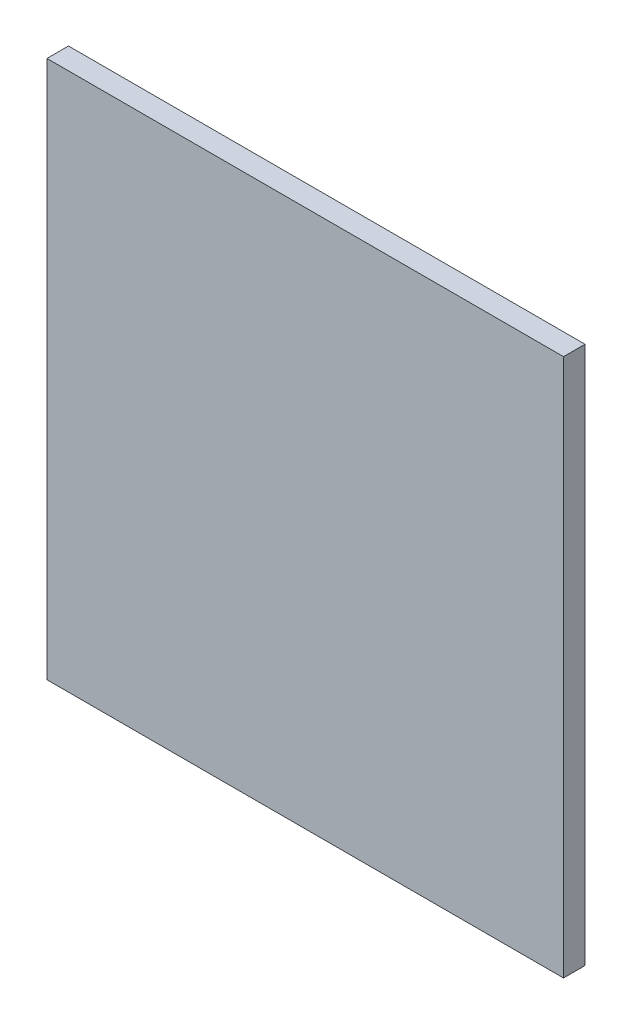
ISO-10303-21;
HEADER;
FILE_DESCRIPTION(('STEP AP214'),'2;1');
FILE_NAME('part.step','',(''),(''),'','','');
FILE_SCHEMA(('AUTOMOTIVE_DESIGN { 1 0 10303 214 1 1 1 1 }'));
ENDSEC;
DATA;
#1=APPLICATION_CONTEXT('core data for automotive mechanical design processes');
#2=APPLICATION_PROTOCOL_DEFINITION('international standard','automotive_design',2000,#1);
#3=PRODUCT_CONTEXT('',#1,'mechanical');
#4=PRODUCT('Part','Part','',(#3));
#5=PRODUCT_RELATED_PRODUCT_CATEGORY('part','',(#4));
#6=PRODUCT_DEFINITION_FORMATION('','',#4);
#7=PRODUCT_DEFINITION_CONTEXT('part definition',#1,'design');
#8=PRODUCT_DEFINITION('design','',#6,#7);
#9=PRODUCT_DEFINITION_SHAPE('','',#8);
#10=(LENGTH_UNIT() NAMED_UNIT(*) SI_UNIT(.MILLI.,.METRE.));
#11=(NAMED_UNIT(*) PLANE_ANGLE_UNIT() SI_UNIT($,.RADIAN.));
#12=(NAMED_UNIT(*) SI_UNIT($,.STERADIAN.) SOLID_ANGLE_UNIT());
#13=UNCERTAINTY_MEASURE_WITH_UNIT(LENGTH_MEASURE(1.E-05),#10,'distance_accuracy_value','');
#14=(GEOMETRIC_REPRESENTATION_CONTEXT(3) GLOBAL_UNCERTAINTY_ASSIGNED_CONTEXT((#13)) GLOBAL_UNIT_ASSIGNED_CONTEXT((#10,
#11,#12)) REPRESENTATION_CONTEXT('',''));
#15=CARTESIAN_POINT('',(0.,0.,0.));
#16=DIRECTION('',(0.,0.,1.));
#17=DIRECTION('',(1.,0.,0.));
#18=AXIS2_PLACEMENT_3D('',#15,#16,#17);
#19=CARTESIAN_POINT('',(240.,250.,20.));
#20=DIRECTION('',(-1.,0.,0.));
#21=DIRECTION('',(0.,-1.,0.));
#22=AXIS2_PLACEMENT_3D('',#19,#20,#21);
#23=PLANE('',#22);
#24=DIRECTION('',(0.,1.,0.));
#25=VECTOR('',#24,1.);
#26=CARTESIAN_POINT('',(240.,250.,0.));
#27=LINE('',#26,#25);
#28=CARTESIAN_POINT('',(240.,-250.,0.));
#29=VERTEX_POINT('',#28);
#30=CARTESIAN_POINT('',(240.,250.,0.));
#31=VERTEX_POINT('',#30);
#32=EDGE_CURVE('E100',#29,#31,#27,.T.);
#33=ORIENTED_EDGE('',*,*,#32,.T.);
#34=DIRECTION('',(0.,0.,-1.));
#35=VECTOR('',#34,1.);
#36=CARTESIAN_POINT('',(240.,250.,20.));
#37=LINE('',#36,#35);
#38=CARTESIAN_POINT('',(240.,250.,20.));
#39=VERTEX_POINT('',#38);
#40=EDGE_CURVE('E11',#39,#31,#37,.T.);
#41=ORIENTED_EDGE('',*,*,#40,.F.);
#42=DIRECTION('',(0.,1.,0.));
#43=VECTOR('',#42,1.);
#44=CARTESIAN_POINT('',(240.,250.,20.));
#45=LINE('',#44,#43);
#46=CARTESIAN_POINT('',(240.,-250.,20.));
#47=VERTEX_POINT('',#46);
#48=EDGE_CURVE('E88',#47,#39,#45,.T.);
#49=ORIENTED_EDGE('',*,*,#48,.F.);
#50=DIRECTION('',(0.,0.,-1.));
#51=VECTOR('',#50,1.);
#52=CARTESIAN_POINT('',(240.,-250.,20.));
#53=LINE('',#52,#51);
#54=EDGE_CURVE('E96',#47,#29,#53,.T.);
#55=ORIENTED_EDGE('',*,*,#54,.T.);
#56=EDGE_LOOP('',(#33,#41,#49,#55));
#57=FACE_BOUND('',#56,.T.);
#58=ADVANCED_FACE('F37',(#57),#23,.F.);
#59=CARTESIAN_POINT('',(-240.,250.,20.));
#60=DIRECTION('',(0.,-1.,0.));
#61=DIRECTION('',(0.,0.,-1.));
#62=AXIS2_PLACEMENT_3D('',#59,#60,#61);
#63=PLANE('',#62);
#64=DIRECTION('',(-1.,0.,0.));
#65=VECTOR('',#64,1.);
#66=CARTESIAN_POINT('',(-240.,250.,0.));
#67=LINE('',#66,#65);
#68=CARTESIAN_POINT('',(-240.,250.,0.));
#69=VERTEX_POINT('',#68);
#70=EDGE_CURVE('E92',#31,#69,#67,.T.);
#71=ORIENTED_EDGE('',*,*,#70,.T.);
#72=DIRECTION('',(0.,0.,-1.));
#73=VECTOR('',#72,1.);
#74=CARTESIAN_POINT('',(-240.,250.,20.));
#75=LINE('',#74,#73);
#76=CARTESIAN_POINT('',(-240.,250.,20.));
#77=VERTEX_POINT('',#76);
#78=EDGE_CURVE('E45',#77,#69,#75,.T.);
#79=ORIENTED_EDGE('',*,*,#78,.F.);
#80=DIRECTION('',(-1.,0.,0.));
#81=VECTOR('',#80,1.);
#82=CARTESIAN_POINT('',(-240.,250.,20.));
#83=LINE('',#82,#81);
#84=EDGE_CURVE('E83',#39,#77,#83,.T.);
#85=ORIENTED_EDGE('',*,*,#84,.F.);
#86=ORIENTED_EDGE('',*,*,#40,.T.);
#87=EDGE_LOOP('',(#71,#79,#85,#86));
#88=FACE_BOUND('',#87,.T.);
#89=ADVANCED_FACE('F91',(#88),#63,.F.);
#90=CARTESIAN_POINT('',(-240.,250.,20.));
#91=DIRECTION('',(1.,0.,0.));
#92=DIRECTION('',(0.,1.,0.));
#93=AXIS2_PLACEMENT_3D('',#90,#91,#92);
#94=PLANE('',#93);
#95=DIRECTION('',(0.,-1.,0.));
#96=VECTOR('',#95,1.);
#97=CARTESIAN_POINT('',(-240.,250.,0.));
#98=LINE('',#97,#96);
#99=CARTESIAN_POINT('',(-240.,-250.,0.));
#100=VERTEX_POINT('',#99);
#101=EDGE_CURVE('E70',#69,#100,#98,.T.);
#102=ORIENTED_EDGE('',*,*,#101,.T.);
#103=DIRECTION('',(0.,0.,-1.));
#104=VECTOR('',#103,1.);
#105=CARTESIAN_POINT('',(-240.,-250.,20.));
#106=LINE('',#105,#104);
#107=CARTESIAN_POINT('',(-240.,-250.,20.));
#108=VERTEX_POINT('',#107);
#109=EDGE_CURVE('E93',#108,#100,#106,.T.);
#110=ORIENTED_EDGE('',*,*,#109,.F.);
#111=DIRECTION('',(0.,-1.,0.));
#112=VECTOR('',#111,1.);
#113=CARTESIAN_POINT('',(-240.,250.,20.));
#114=LINE('',#113,#112);
#115=EDGE_CURVE('E86',#77,#108,#114,.T.);
#116=ORIENTED_EDGE('',*,*,#115,.F.);
#117=ORIENTED_EDGE('',*,*,#78,.T.);
#118=EDGE_LOOP('',(#102,#110,#116,#117));
#119=FACE_BOUND('',#118,.T.);
#120=ADVANCED_FACE('F94',(#119),#94,.F.);
#121=CARTESIAN_POINT('',(-240.,-250.,20.));
#122=DIRECTION('',(0.,1.,0.));
#123=DIRECTION('',(0.,0.,1.));
#124=AXIS2_PLACEMENT_3D('',#121,#122,#123);
#125=PLANE('',#124);
#126=DIRECTION('',(1.,0.,0.));
#127=VECTOR('',#126,1.);
#128=CARTESIAN_POINT('',(-240.,-250.,0.));
#129=LINE('',#128,#127);
#130=EDGE_CURVE('E76',#100,#29,#129,.T.);
#131=ORIENTED_EDGE('',*,*,#130,.T.);
#132=ORIENTED_EDGE('',*,*,#54,.F.);
#133=DIRECTION('',(1.,0.,0.));
#134=VECTOR('',#133,1.);
#135=CARTESIAN_POINT('',(-240.,-250.,20.));
#136=LINE('',#135,#134);
#137=EDGE_CURVE('E53',#108,#47,#136,.T.);
#138=ORIENTED_EDGE('',*,*,#137,.F.);
#139=ORIENTED_EDGE('',*,*,#109,.T.);
#140=EDGE_LOOP('',(#131,#132,#138,#139));
#141=FACE_BOUND('',#140,.T.);
#142=ADVANCED_FACE('F107',(#141),#125,.F.);
#143=CARTESIAN_POINT('',(0.,0.,20.));
#144=DIRECTION('',(0.,0.,1.));
#145=DIRECTION('',(1.,0.,0.));
#146=AXIS2_PLACEMENT_3D('',#143,#144,#145);
#147=PLANE('',#146);
#148=ORIENTED_EDGE('',*,*,#48,.T.);
#149=ORIENTED_EDGE('',*,*,#84,.T.);
#150=ORIENTED_EDGE('',*,*,#115,.T.);
#151=ORIENTED_EDGE('',*,*,#137,.T.);
#152=EDGE_LOOP('',(#148,#149,#150,#151));
#153=FACE_BOUND('',#152,.T.);
#154=ADVANCED_FACE('F84',(#153),#147,.T.);
#155=CARTESIAN_POINT('',(0.,0.,0.));
#156=DIRECTION('',(0.,0.,1.));
#157=DIRECTION('',(1.,0.,0.));
#158=AXIS2_PLACEMENT_3D('',#155,#156,#157);
#159=PLANE('',#158);
#160=ORIENTED_EDGE('',*,*,#32,.F.);
#161=ORIENTED_EDGE('',*,*,#130,.F.);
#162=ORIENTED_EDGE('',*,*,#101,.F.);
#163=ORIENTED_EDGE('',*,*,#70,.F.);
#164=EDGE_LOOP('',(#160,#161,#162,#163));
#165=FACE_BOUND('',#164,.T.);
#166=ADVANCED_FACE('F110',(#165),#159,.F.);
#167=CLOSED_SHELL('',(#58,#89,#120,#142,#154,#166));
#168=MANIFOLD_SOLID_BREP('B2',#167);
#169=ADVANCED_BREP_SHAPE_REPRESENTATION('',(#18,#168),#14);
#170=SHAPE_DEFINITION_REPRESENTATION(#9,#169);
ENDSEC;
END-ISO-10303-21;
